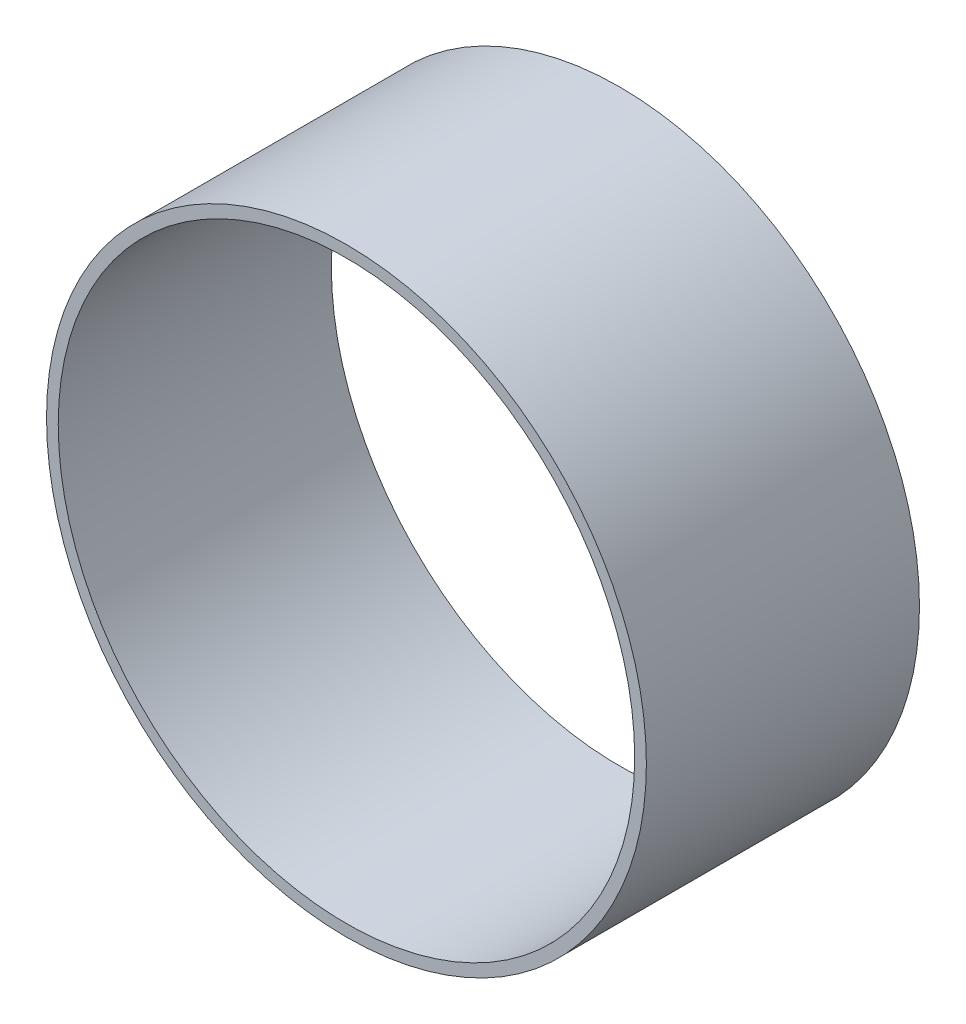
ISO-10303-21;
HEADER;
FILE_DESCRIPTION(('STEP AP214'),'2;1');
FILE_NAME('part.step','',(''),(''),'','','');
FILE_SCHEMA(('AUTOMOTIVE_DESIGN { 1 0 10303 214 1 1 1 1 }'));
ENDSEC;
DATA;
#1=APPLICATION_CONTEXT('core data for automotive mechanical design processes');
#2=APPLICATION_PROTOCOL_DEFINITION('international standard','automotive_design',2000,#1);
#3=PRODUCT_CONTEXT('',#1,'mechanical');
#4=PRODUCT('Part','Part','',(#3));
#5=PRODUCT_RELATED_PRODUCT_CATEGORY('part','',(#4));
#6=PRODUCT_DEFINITION_FORMATION('','',#4);
#7=PRODUCT_DEFINITION_CONTEXT('part definition',#1,'design');
#8=PRODUCT_DEFINITION('design','',#6,#7);
#9=PRODUCT_DEFINITION_SHAPE('','',#8);
#10=(LENGTH_UNIT() NAMED_UNIT(*) SI_UNIT(.MILLI.,.METRE.));
#11=(NAMED_UNIT(*) PLANE_ANGLE_UNIT() SI_UNIT($,.RADIAN.));
#12=(NAMED_UNIT(*) SI_UNIT($,.STERADIAN.) SOLID_ANGLE_UNIT());
#13=UNCERTAINTY_MEASURE_WITH_UNIT(LENGTH_MEASURE(1.E-05),#10,'distance_accuracy_value','');
#14=(GEOMETRIC_REPRESENTATION_CONTEXT(3) GLOBAL_UNCERTAINTY_ASSIGNED_CONTEXT((#13)) GLOBAL_UNIT_ASSIGNED_CONTEXT((#10,
#11,#12)) REPRESENTATION_CONTEXT('',''));
#15=CARTESIAN_POINT('',(0.,0.,0.));
#16=DIRECTION('',(0.,0.,1.));
#17=DIRECTION('',(1.,0.,0.));
#18=AXIS2_PLACEMENT_3D('',#15,#16,#17);
#19=CARTESIAN_POINT('',(0.,0.,35.));
#20=DIRECTION('',(0.,0.,1.));
#21=DIRECTION('',(1.,0.,0.));
#22=AXIS2_PLACEMENT_3D('',#19,#20,#21);
#23=PLANE('',#22);
#24=CARTESIAN_POINT('',(0.,0.,35.));
#25=DIRECTION('',(0.,0.,1.));
#26=DIRECTION('',(1.,0.,0.));
#27=AXIS2_PLACEMENT_3D('',#24,#25,#26);
#28=CIRCLE('',#27,76.8769230769231);
#29=CARTESIAN_POINT('',(76.8769230769231,0.,35.));
#30=VERTEX_POINT('',#29);
#31=EDGE_CURVE('E10',#30,#30,#28,.T.);
#32=ORIENTED_EDGE('',*,*,#31,.T.);
#33=EDGE_LOOP('',(#32));
#34=FACE_BOUND('',#33,.T.);
#35=CARTESIAN_POINT('',(0.,0.,35.));
#36=DIRECTION('',(0.,0.,1.));
#37=DIRECTION('',(1.,0.,0.));
#38=AXIS2_PLACEMENT_3D('',#35,#36,#37);
#39=CIRCLE('',#38,73.8769230769231);
#40=CARTESIAN_POINT('',(73.8769230769231,0.,35.));
#41=VERTEX_POINT('',#40);
#42=EDGE_CURVE('E46',#41,#41,#39,.T.);
#43=ORIENTED_EDGE('',*,*,#42,.F.);
#44=EDGE_LOOP('',(#43));
#45=FACE_BOUND('',#44,.T.);
#46=ADVANCED_FACE('F35',(#34,#45),#23,.T.);
#47=CARTESIAN_POINT('',(0.,0.,-35.));
#48=DIRECTION('',(0.,0.,1.));
#49=DIRECTION('',(1.,0.,0.));
#50=AXIS2_PLACEMENT_3D('',#47,#48,#49);
#51=PLANE('',#50);
#52=CARTESIAN_POINT('',(0.,0.,-35.));
#53=DIRECTION('',(0.,0.,1.));
#54=DIRECTION('',(1.,0.,0.));
#55=AXIS2_PLACEMENT_3D('',#52,#53,#54);
#56=CIRCLE('',#55,76.8769230769231);
#57=CARTESIAN_POINT('',(76.8769230769231,0.,-35.));
#58=VERTEX_POINT('',#57);
#59=EDGE_CURVE('E39',#58,#58,#56,.T.);
#60=ORIENTED_EDGE('',*,*,#59,.F.);
#61=EDGE_LOOP('',(#60));
#62=FACE_BOUND('',#61,.T.);
#63=CARTESIAN_POINT('',(0.,0.,-35.));
#64=DIRECTION('',(0.,0.,1.));
#65=DIRECTION('',(1.,0.,0.));
#66=AXIS2_PLACEMENT_3D('',#63,#64,#65);
#67=CIRCLE('',#66,73.8769230769231);
#68=CARTESIAN_POINT('',(73.8769230769231,0.,-35.));
#69=VERTEX_POINT('',#68);
#70=EDGE_CURVE('E48',#69,#69,#67,.T.);
#71=ORIENTED_EDGE('',*,*,#70,.T.);
#72=EDGE_LOOP('',(#71));
#73=FACE_BOUND('',#72,.T.);
#74=ADVANCED_FACE('F58',(#62,#73),#51,.F.);
#75=CARTESIAN_POINT('',(0.,0.,35.));
#76=DIRECTION('',(0.,0.,-1.));
#77=DIRECTION('',(-1.,0.,0.));
#78=AXIS2_PLACEMENT_3D('',#75,#76,#77);
#79=CYLINDRICAL_SURFACE('',#78,76.8769230769231);
#80=ORIENTED_EDGE('',*,*,#31,.F.);
#81=EDGE_LOOP('',(#80));
#82=FACE_BOUND('',#81,.T.);
#83=ORIENTED_EDGE('',*,*,#59,.T.);
#84=EDGE_LOOP('',(#83));
#85=FACE_BOUND('',#84,.T.);
#86=ADVANCED_FACE('F37',(#82,#85),#79,.T.);
#87=CARTESIAN_POINT('',(0.,0.,35.));
#88=DIRECTION('',(0.,0.,-1.));
#89=DIRECTION('',(-1.,0.,0.));
#90=AXIS2_PLACEMENT_3D('',#87,#88,#89);
#91=CYLINDRICAL_SURFACE('',#90,73.8769230769231);
#92=ORIENTED_EDGE('',*,*,#42,.T.);
#93=EDGE_LOOP('',(#92));
#94=FACE_BOUND('',#93,.T.);
#95=ORIENTED_EDGE('',*,*,#70,.F.);
#96=EDGE_LOOP('',(#95));
#97=FACE_BOUND('',#96,.T.);
#98=ADVANCED_FACE('F54',(#94,#97),#91,.F.);
#99=CLOSED_SHELL('',(#46,#74,#86,#98));
#100=MANIFOLD_SOLID_BREP('B2',#99);
#101=ADVANCED_BREP_SHAPE_REPRESENTATION('',(#18,#100),#14);
#102=SHAPE_DEFINITION_REPRESENTATION(#9,#101);
ENDSEC;
END-ISO-10303-21;
